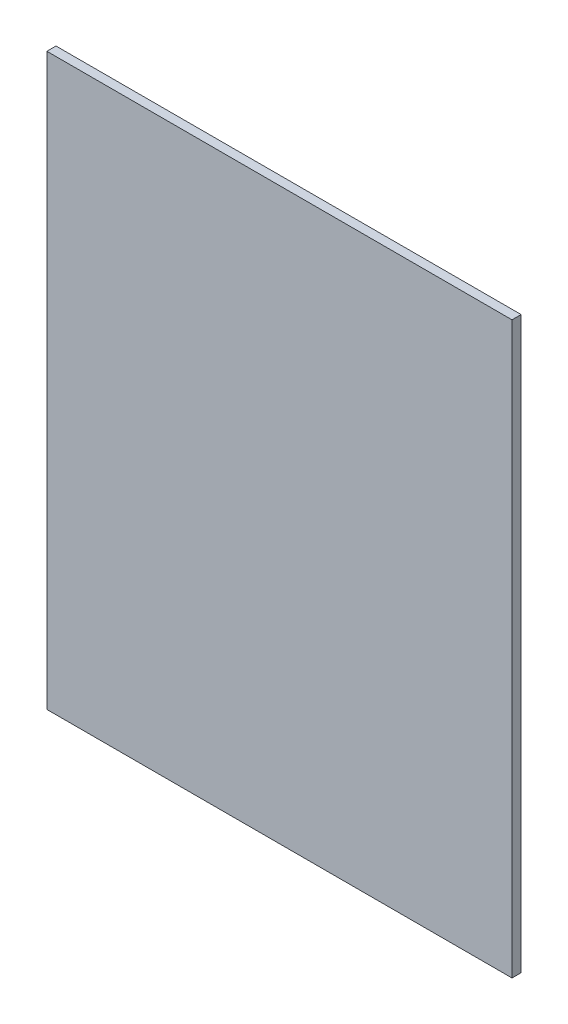
ISO-10303-21;
HEADER;
FILE_DESCRIPTION(('STEP AP214'),'2;1');
FILE_NAME('part.step','',(''),(''),'','','');
FILE_SCHEMA(('AUTOMOTIVE_DESIGN { 1 0 10303 214 1 1 1 1 }'));
ENDSEC;
DATA;
#1=APPLICATION_CONTEXT('core data for automotive mechanical design processes');
#2=APPLICATION_PROTOCOL_DEFINITION('international standard','automotive_design',2000,#1);
#3=PRODUCT_CONTEXT('',#1,'mechanical');
#4=PRODUCT('Part','Part','',(#3));
#5=PRODUCT_RELATED_PRODUCT_CATEGORY('part','',(#4));
#6=PRODUCT_DEFINITION_FORMATION('','',#4);
#7=PRODUCT_DEFINITION_CONTEXT('part definition',#1,'design');
#8=PRODUCT_DEFINITION('design','',#6,#7);
#9=PRODUCT_DEFINITION_SHAPE('','',#8);
#10=(LENGTH_UNIT() NAMED_UNIT(*) SI_UNIT(.MILLI.,.METRE.));
#11=(NAMED_UNIT(*) PLANE_ANGLE_UNIT() SI_UNIT($,.RADIAN.));
#12=(NAMED_UNIT(*) SI_UNIT($,.STERADIAN.) SOLID_ANGLE_UNIT());
#13=UNCERTAINTY_MEASURE_WITH_UNIT(LENGTH_MEASURE(1.E-05),#10,'distance_accuracy_value','');
#14=(GEOMETRIC_REPRESENTATION_CONTEXT(3) GLOBAL_UNCERTAINTY_ASSIGNED_CONTEXT((#13)) GLOBAL_UNIT_ASSIGNED_CONTEXT((#10,
#11,#12)) REPRESENTATION_CONTEXT('',''));
#15=CARTESIAN_POINT('',(0.,0.,0.));
#16=DIRECTION('',(0.,0.,1.));
#17=DIRECTION('',(1.,0.,0.));
#18=AXIS2_PLACEMENT_3D('',#15,#16,#17);
#19=CARTESIAN_POINT('',(102.,-125.,4.));
#20=DIRECTION('',(-1.,0.,0.));
#21=DIRECTION('',(0.,0.,1.));
#22=AXIS2_PLACEMENT_3D('',#19,#20,#21);
#23=PLANE('',#22);
#24=DIRECTION('',(0.,1.,0.));
#25=VECTOR('',#24,1.);
#26=CARTESIAN_POINT('',(102.,-125.,0.));
#27=LINE('',#26,#25);
#28=CARTESIAN_POINT('',(102.,-125.,0.));
#29=VERTEX_POINT('',#28);
#30=CARTESIAN_POINT('',(102.,125.,0.));
#31=VERTEX_POINT('',#30);
#32=EDGE_CURVE('E95',#29,#31,#27,.T.);
#33=ORIENTED_EDGE('',*,*,#32,.T.);
#34=DIRECTION('',(0.,0.,-1.));
#35=VECTOR('',#34,1.);
#36=CARTESIAN_POINT('',(102.,125.,4.));
#37=LINE('',#36,#35);
#38=CARTESIAN_POINT('',(102.,125.,4.));
#39=VERTEX_POINT('',#38);
#40=EDGE_CURVE('E11',#39,#31,#37,.T.);
#41=ORIENTED_EDGE('',*,*,#40,.F.);
#42=DIRECTION('',(0.,1.,0.));
#43=VECTOR('',#42,1.);
#44=CARTESIAN_POINT('',(102.,-125.,4.));
#45=LINE('',#44,#43);
#46=CARTESIAN_POINT('',(102.,-125.,4.));
#47=VERTEX_POINT('',#46);
#48=EDGE_CURVE('E83',#47,#39,#45,.T.);
#49=ORIENTED_EDGE('',*,*,#48,.F.);
#50=DIRECTION('',(0.,0.,-1.));
#51=VECTOR('',#50,1.);
#52=CARTESIAN_POINT('',(102.,-125.,4.));
#53=LINE('',#52,#51);
#54=EDGE_CURVE('E91',#47,#29,#53,.T.);
#55=ORIENTED_EDGE('',*,*,#54,.T.);
#56=EDGE_LOOP('',(#33,#41,#49,#55));
#57=FACE_BOUND('',#56,.T.);
#58=ADVANCED_FACE('F32',(#57),#23,.F.);
#59=CARTESIAN_POINT('',(-102.,125.,4.));
#60=DIRECTION('',(0.,-1.,0.));
#61=DIRECTION('',(0.,0.,-1.));
#62=AXIS2_PLACEMENT_3D('',#59,#60,#61);
#63=PLANE('',#62);
#64=DIRECTION('',(-1.,0.,0.));
#65=VECTOR('',#64,1.);
#66=CARTESIAN_POINT('',(-102.,125.,0.));
#67=LINE('',#66,#65);
#68=CARTESIAN_POINT('',(-102.,125.,0.));
#69=VERTEX_POINT('',#68);
#70=EDGE_CURVE('E87',#31,#69,#67,.T.);
#71=ORIENTED_EDGE('',*,*,#70,.T.);
#72=DIRECTION('',(0.,0.,-1.));
#73=VECTOR('',#72,1.);
#74=CARTESIAN_POINT('',(-102.,125.,4.));
#75=LINE('',#74,#73);
#76=CARTESIAN_POINT('',(-102.,125.,4.));
#77=VERTEX_POINT('',#76);
#78=EDGE_CURVE('E40',#77,#69,#75,.T.);
#79=ORIENTED_EDGE('',*,*,#78,.F.);
#80=DIRECTION('',(-1.,0.,0.));
#81=VECTOR('',#80,1.);
#82=CARTESIAN_POINT('',(-102.,125.,4.));
#83=LINE('',#82,#81);
#84=EDGE_CURVE('E78',#39,#77,#83,.T.);
#85=ORIENTED_EDGE('',*,*,#84,.F.);
#86=ORIENTED_EDGE('',*,*,#40,.T.);
#87=EDGE_LOOP('',(#71,#79,#85,#86));
#88=FACE_BOUND('',#87,.T.);
#89=ADVANCED_FACE('F86',(#88),#63,.F.);
#90=CARTESIAN_POINT('',(-102.,-125.,4.));
#91=DIRECTION('',(1.,0.,0.));
#92=DIRECTION('',(0.,0.,-1.));
#93=AXIS2_PLACEMENT_3D('',#90,#91,#92);
#94=PLANE('',#93);
#95=DIRECTION('',(0.,-1.,0.));
#96=VECTOR('',#95,1.);
#97=CARTESIAN_POINT('',(-102.,-125.,0.));
#98=LINE('',#97,#96);
#99=CARTESIAN_POINT('',(-102.,-125.,0.));
#100=VERTEX_POINT('',#99);
#101=EDGE_CURVE('E65',#69,#100,#98,.T.);
#102=ORIENTED_EDGE('',*,*,#101,.T.);
#103=DIRECTION('',(0.,0.,-1.));
#104=VECTOR('',#103,1.);
#105=CARTESIAN_POINT('',(-102.,-125.,4.));
#106=LINE('',#105,#104);
#107=CARTESIAN_POINT('',(-102.,-125.,4.));
#108=VERTEX_POINT('',#107);
#109=EDGE_CURVE('E88',#108,#100,#106,.T.);
#110=ORIENTED_EDGE('',*,*,#109,.F.);
#111=DIRECTION('',(0.,-1.,0.));
#112=VECTOR('',#111,1.);
#113=CARTESIAN_POINT('',(-102.,-125.,4.));
#114=LINE('',#113,#112);
#115=EDGE_CURVE('E81',#77,#108,#114,.T.);
#116=ORIENTED_EDGE('',*,*,#115,.F.);
#117=ORIENTED_EDGE('',*,*,#78,.T.);
#118=EDGE_LOOP('',(#102,#110,#116,#117));
#119=FACE_BOUND('',#118,.T.);
#120=ADVANCED_FACE('F89',(#119),#94,.F.);
#121=CARTESIAN_POINT('',(-102.,-125.,4.));
#122=DIRECTION('',(0.,1.,0.));
#123=DIRECTION('',(0.,0.,1.));
#124=AXIS2_PLACEMENT_3D('',#121,#122,#123);
#125=PLANE('',#124);
#126=DIRECTION('',(1.,0.,0.));
#127=VECTOR('',#126,1.);
#128=CARTESIAN_POINT('',(-102.,-125.,0.));
#129=LINE('',#128,#127);
#130=EDGE_CURVE('E71',#100,#29,#129,.T.);
#131=ORIENTED_EDGE('',*,*,#130,.T.);
#132=ORIENTED_EDGE('',*,*,#54,.F.);
#133=DIRECTION('',(1.,0.,0.));
#134=VECTOR('',#133,1.);
#135=CARTESIAN_POINT('',(-102.,-125.,4.));
#136=LINE('',#135,#134);
#137=EDGE_CURVE('E48',#108,#47,#136,.T.);
#138=ORIENTED_EDGE('',*,*,#137,.F.);
#139=ORIENTED_EDGE('',*,*,#109,.T.);
#140=EDGE_LOOP('',(#131,#132,#138,#139));
#141=FACE_BOUND('',#140,.T.);
#142=ADVANCED_FACE('F102',(#141),#125,.F.);
#143=CARTESIAN_POINT('',(0.,0.,4.));
#144=DIRECTION('',(0.,0.,-1.));
#145=DIRECTION('',(-1.,0.,0.));
#146=AXIS2_PLACEMENT_3D('',#143,#144,#145);
#147=PLANE('',#146);
#148=ORIENTED_EDGE('',*,*,#48,.T.);
#149=ORIENTED_EDGE('',*,*,#84,.T.);
#150=ORIENTED_EDGE('',*,*,#115,.T.);
#151=ORIENTED_EDGE('',*,*,#137,.T.);
#152=EDGE_LOOP('',(#148,#149,#150,#151));
#153=FACE_BOUND('',#152,.T.);
#154=ADVANCED_FACE('F79',(#153),#147,.F.);
#155=CARTESIAN_POINT('',(0.,0.,0.));
#156=DIRECTION('',(0.,0.,-1.));
#157=DIRECTION('',(-1.,0.,0.));
#158=AXIS2_PLACEMENT_3D('',#155,#156,#157);
#159=PLANE('',#158);
#160=ORIENTED_EDGE('',*,*,#32,.F.);
#161=ORIENTED_EDGE('',*,*,#130,.F.);
#162=ORIENTED_EDGE('',*,*,#101,.F.);
#163=ORIENTED_EDGE('',*,*,#70,.F.);
#164=EDGE_LOOP('',(#160,#161,#162,#163));
#165=FACE_BOUND('',#164,.T.);
#166=ADVANCED_FACE('F105',(#165),#159,.T.);
#167=CLOSED_SHELL('',(#58,#89,#120,#142,#154,#166));
#168=MANIFOLD_SOLID_BREP('B2',#167);
#169=ADVANCED_BREP_SHAPE_REPRESENTATION('',(#18,#168),#14);
#170=SHAPE_DEFINITION_REPRESENTATION(#9,#169);
ENDSEC;
END-ISO-10303-21;
